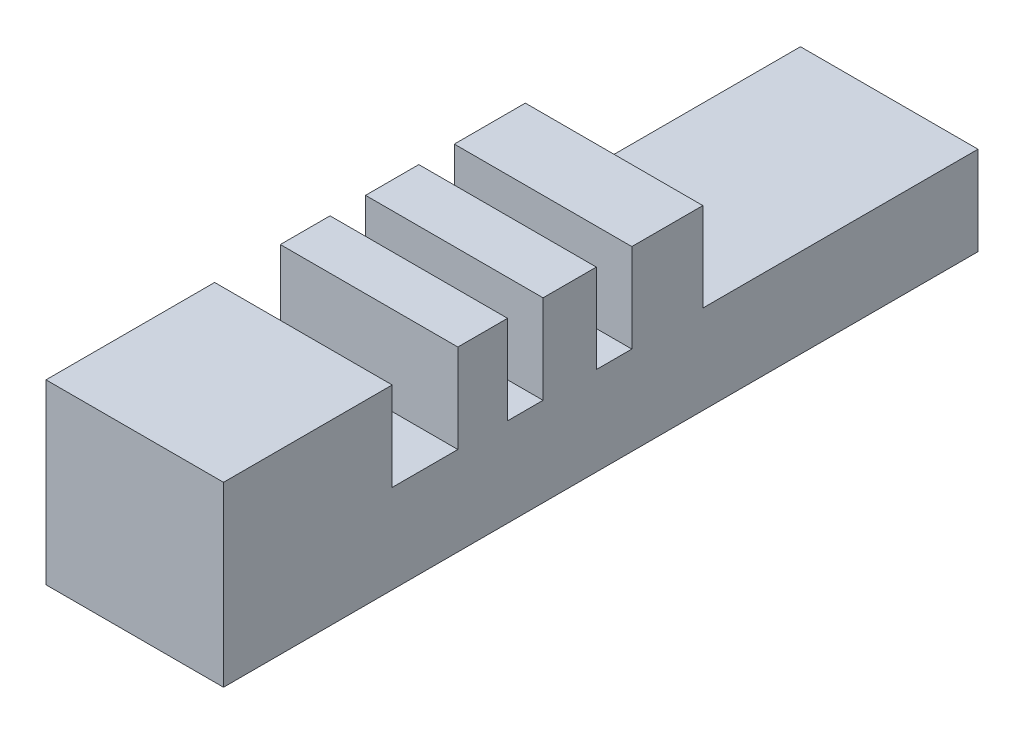
ISO-10303-21;
HEADER;
FILE_DESCRIPTION(('STEP AP214'),'2;1');
FILE_NAME('part.step','',(''),(''),'','','');
FILE_SCHEMA(('AUTOMOTIVE_DESIGN { 1 0 10303 214 1 1 1 1 }'));
ENDSEC;
DATA;
#1=APPLICATION_CONTEXT('core data for automotive mechanical design processes');
#2=APPLICATION_PROTOCOL_DEFINITION('international standard','automotive_design',2000,#1);
#3=PRODUCT_CONTEXT('',#1,'mechanical');
#4=PRODUCT('Part','Part','',(#3));
#5=PRODUCT_RELATED_PRODUCT_CATEGORY('part','',(#4));
#6=PRODUCT_DEFINITION_FORMATION('','',#4);
#7=PRODUCT_DEFINITION_CONTEXT('part definition',#1,'design');
#8=PRODUCT_DEFINITION('design','',#6,#7);
#9=PRODUCT_DEFINITION_SHAPE('','',#8);
#10=(LENGTH_UNIT() NAMED_UNIT(*) SI_UNIT(.MILLI.,.METRE.));
#11=(NAMED_UNIT(*) PLANE_ANGLE_UNIT() SI_UNIT($,.RADIAN.));
#12=(NAMED_UNIT(*) SI_UNIT($,.STERADIAN.) SOLID_ANGLE_UNIT());
#13=UNCERTAINTY_MEASURE_WITH_UNIT(LENGTH_MEASURE(1.E-05),#10,'distance_accuracy_value','');
#14=(GEOMETRIC_REPRESENTATION_CONTEXT(3) GLOBAL_UNCERTAINTY_ASSIGNED_CONTEXT((#13)) GLOBAL_UNIT_ASSIGNED_CONTEXT((#10,
#11,#12)) REPRESENTATION_CONTEXT('',''));
#15=CARTESIAN_POINT('',(0.,0.,0.));
#16=DIRECTION('',(0.,0.,1.));
#17=DIRECTION('',(1.,0.,0.));
#18=AXIS2_PLACEMENT_3D('',#15,#16,#17);
#19=CARTESIAN_POINT('',(0.,5.,0.));
#20=DIRECTION('',(0.,-1.,0.));
#21=DIRECTION('',(0.,0.,-1.));
#22=AXIS2_PLACEMENT_3D('',#19,#20,#21);
#23=PLANE('',#22);
#24=DIRECTION('',(0.,0.,1.));
#25=VECTOR('',#24,1.);
#26=CARTESIAN_POINT('',(0.,5.,0.));
#27=LINE('',#26,#25);
#28=CARTESIAN_POINT('',(0.,5.,-13.2));
#29=VERTEX_POINT('',#28);
#30=CARTESIAN_POINT('',(0.,5.,-9.5));
#31=VERTEX_POINT('',#30);
#32=EDGE_CURVE('E59',#29,#31,#27,.T.);
#33=ORIENTED_EDGE('',*,*,#32,.T.);
#34=DIRECTION('',(1.,0.,0.));
#35=VECTOR('',#34,1.);
#36=CARTESIAN_POINT('',(0.,5.,-9.5));
#37=LINE('',#36,#35);
#38=CARTESIAN_POINT('',(10.,5.,-9.5));
#39=VERTEX_POINT('',#38);
#40=EDGE_CURVE('E54',#31,#39,#37,.T.);
#41=ORIENTED_EDGE('',*,*,#40,.T.);
#42=DIRECTION('',(0.,0.,-1.));
#43=VECTOR('',#42,1.);
#44=CARTESIAN_POINT('',(10.,5.,-42.5));
#45=LINE('',#44,#43);
#46=CARTESIAN_POINT('',(10.,5.,-13.2));
#47=VERTEX_POINT('',#46);
#48=EDGE_CURVE('E271',#39,#47,#45,.T.);
#49=ORIENTED_EDGE('',*,*,#48,.T.);
#50=DIRECTION('',(-1.,0.,0.));
#51=VECTOR('',#50,1.);
#52=CARTESIAN_POINT('',(0.,5.,-13.2));
#53=LINE('',#52,#51);
#54=EDGE_CURVE('E169',#47,#29,#53,.T.);
#55=ORIENTED_EDGE('',*,*,#54,.T.);
#56=EDGE_LOOP('',(#33,#41,#49,#55));
#57=FACE_BOUND('',#56,.T.);
#58=ADVANCED_FACE('F39',(#57),#23,.F.);
#59=CARTESIAN_POINT('',(0.,5.,-18.));
#60=VERTEX_POINT('',#59);
#61=CARTESIAN_POINT('',(0.,5.,-16.));
#62=VERTEX_POINT('',#61);
#63=EDGE_CURVE('E315',#60,#62,#27,.T.);
#64=ORIENTED_EDGE('',*,*,#63,.T.);
#65=DIRECTION('',(1.,0.,0.));
#66=VECTOR('',#65,1.);
#67=CARTESIAN_POINT('',(0.,5.,-16.));
#68=LINE('',#67,#66);
#69=CARTESIAN_POINT('',(10.,5.,-16.));
#70=VERTEX_POINT('',#69);
#71=EDGE_CURVE('E196',#62,#70,#68,.T.);
#72=ORIENTED_EDGE('',*,*,#71,.T.);
#73=CARTESIAN_POINT('',(10.,5.,-18.));
#74=VERTEX_POINT('',#73);
#75=EDGE_CURVE('E274',#70,#74,#45,.T.);
#76=ORIENTED_EDGE('',*,*,#75,.T.);
#77=DIRECTION('',(-1.,0.,0.));
#78=VECTOR('',#77,1.);
#79=CARTESIAN_POINT('',(0.,5.,-18.));
#80=LINE('',#79,#78);
#81=EDGE_CURVE('E217',#74,#60,#80,.T.);
#82=ORIENTED_EDGE('',*,*,#81,.T.);
#83=EDGE_LOOP('',(#64,#72,#76,#82));
#84=FACE_BOUND('',#83,.T.);
#85=ADVANCED_FACE('F357',(#84),#23,.F.);
#86=CARTESIAN_POINT('',(0.,5.,-23.));
#87=VERTEX_POINT('',#86);
#88=CARTESIAN_POINT('',(0.,5.,-21.));
#89=VERTEX_POINT('',#88);
#90=EDGE_CURVE('E279',#87,#89,#27,.T.);
#91=ORIENTED_EDGE('',*,*,#90,.T.);
#92=DIRECTION('',(1.,0.,0.));
#93=VECTOR('',#92,1.);
#94=CARTESIAN_POINT('',(0.,5.,-21.));
#95=LINE('',#94,#93);
#96=CARTESIAN_POINT('',(10.,5.,-21.));
#97=VERTEX_POINT('',#96);
#98=EDGE_CURVE('E222',#89,#97,#95,.T.);
#99=ORIENTED_EDGE('',*,*,#98,.T.);
#100=CARTESIAN_POINT('',(10.,5.,-23.));
#101=VERTEX_POINT('',#100);
#102=EDGE_CURVE('E331',#97,#101,#45,.T.);
#103=ORIENTED_EDGE('',*,*,#102,.T.);
#104=DIRECTION('',(1.,0.,0.));
#105=VECTOR('',#104,1.);
#106=CARTESIAN_POINT('',(0.,5.,-23.));
#107=LINE('',#106,#105);
#108=EDGE_CURVE('E249',#87,#101,#107,.T.);
#109=ORIENTED_EDGE('',*,*,#108,.F.);
#110=EDGE_LOOP('',(#91,#99,#103,#109));
#111=FACE_BOUND('',#110,.T.);
#112=ADVANCED_FACE('F319',(#111),#23,.F.);
#113=CARTESIAN_POINT('',(10.,5.,0.));
#114=DIRECTION('',(0.,0.,-1.));
#115=DIRECTION('',(-1.,0.,0.));
#116=AXIS2_PLACEMENT_3D('',#113,#114,#115);
#117=PLANE('',#116);
#118=DIRECTION('',(1.,0.,0.));
#119=VECTOR('',#118,1.);
#120=CARTESIAN_POINT('',(10.,0.,0.));
#121=LINE('',#120,#119);
#122=CARTESIAN_POINT('',(0.,0.,0.));
#123=VERTEX_POINT('',#122);
#124=CARTESIAN_POINT('',(10.,0.,0.));
#125=VERTEX_POINT('',#124);
#126=EDGE_CURVE('E270',#123,#125,#121,.T.);
#127=ORIENTED_EDGE('',*,*,#126,.T.);
#128=DIRECTION('',(0.,-1.,0.));
#129=VECTOR('',#128,1.);
#130=CARTESIAN_POINT('',(10.,5.,0.));
#131=LINE('',#130,#129);
#132=CARTESIAN_POINT('',(10.,10.,0.));
#133=VERTEX_POINT('',#132);
#134=EDGE_CURVE('E11',#133,#125,#131,.T.);
#135=ORIENTED_EDGE('',*,*,#134,.F.);
#136=DIRECTION('',(1.,0.,0.));
#137=VECTOR('',#136,1.);
#138=CARTESIAN_POINT('',(0.,10.,0.));
#139=LINE('',#138,#137);
#140=CARTESIAN_POINT('',(0.,10.,0.));
#141=VERTEX_POINT('',#140);
#142=EDGE_CURVE('E180',#141,#133,#139,.T.);
#143=ORIENTED_EDGE('',*,*,#142,.F.);
#144=DIRECTION('',(0.,-1.,0.));
#145=VECTOR('',#144,1.);
#146=CARTESIAN_POINT('',(0.,5.,0.));
#147=LINE('',#146,#145);
#148=EDGE_CURVE('E176',#141,#123,#147,.T.);
#149=ORIENTED_EDGE('',*,*,#148,.T.);
#150=EDGE_LOOP('',(#127,#135,#143,#149));
#151=FACE_BOUND('',#150,.T.);
#152=ADVANCED_FACE('F41',(#151),#117,.F.);
#153=CARTESIAN_POINT('',(10.,5.,-42.5));
#154=DIRECTION('',(-1.,0.,0.));
#155=DIRECTION('',(0.,0.,1.));
#156=AXIS2_PLACEMENT_3D('',#153,#154,#155);
#157=PLANE('',#156);
#158=DIRECTION('',(0.,0.,-1.));
#159=VECTOR('',#158,1.);
#160=CARTESIAN_POINT('',(10.,0.,-42.5));
#161=LINE('',#160,#159);
#162=CARTESIAN_POINT('',(10.,0.,-42.5));
#163=VERTEX_POINT('',#162);
#164=EDGE_CURVE('E282',#125,#163,#161,.T.);
#165=ORIENTED_EDGE('',*,*,#164,.T.);
#166=DIRECTION('',(0.,-1.,0.));
#167=VECTOR('',#166,1.);
#168=CARTESIAN_POINT('',(10.,5.,-42.5));
#169=LINE('',#168,#167);
#170=CARTESIAN_POINT('',(10.,5.,-42.5));
#171=VERTEX_POINT('',#170);
#172=EDGE_CURVE('E47',#171,#163,#169,.T.);
#173=ORIENTED_EDGE('',*,*,#172,.F.);
#174=CARTESIAN_POINT('',(10.,5.,-27.));
#175=VERTEX_POINT('',#174);
#176=EDGE_CURVE('E275',#175,#171,#45,.T.);
#177=ORIENTED_EDGE('',*,*,#176,.F.);
#178=DIRECTION('',(0.,-1.,0.));
#179=VECTOR('',#178,1.);
#180=CARTESIAN_POINT('',(10.,10.,-27.));
#181=LINE('',#180,#179);
#182=CARTESIAN_POINT('',(10.,10.,-27.));
#183=VERTEX_POINT('',#182);
#184=EDGE_CURVE('E255',#183,#175,#181,.T.);
#185=ORIENTED_EDGE('',*,*,#184,.F.);
#186=DIRECTION('',(0.,0.,-1.));
#187=VECTOR('',#186,1.);
#188=CARTESIAN_POINT('',(10.,10.,0.));
#189=LINE('',#188,#187);
#190=CARTESIAN_POINT('',(10.,10.,-23.));
#191=VERTEX_POINT('',#190);
#192=EDGE_CURVE('E253',#191,#183,#189,.T.);
#193=ORIENTED_EDGE('',*,*,#192,.F.);
#194=DIRECTION('',(0.,-1.,0.));
#195=VECTOR('',#194,1.);
#196=CARTESIAN_POINT('',(10.,10.,-23.));
#197=LINE('',#196,#195);
#198=EDGE_CURVE('E261',#191,#101,#197,.T.);
#199=ORIENTED_EDGE('',*,*,#198,.T.);
#200=ORIENTED_EDGE('',*,*,#102,.F.);
#201=DIRECTION('',(0.,-1.,0.));
#202=VECTOR('',#201,1.);
#203=CARTESIAN_POINT('',(10.,10.,-21.));
#204=LINE('',#203,#202);
#205=CARTESIAN_POINT('',(10.,10.,-21.));
#206=VERTEX_POINT('',#205);
#207=EDGE_CURVE('E238',#206,#97,#204,.T.);
#208=ORIENTED_EDGE('',*,*,#207,.F.);
#209=DIRECTION('',(0.,0.,-1.));
#210=VECTOR('',#209,1.);
#211=CARTESIAN_POINT('',(10.,10.,0.));
#212=LINE('',#211,#210);
#213=CARTESIAN_POINT('',(10.,10.,-18.));
#214=VERTEX_POINT('',#213);
#215=EDGE_CURVE('E221',#214,#206,#212,.T.);
#216=ORIENTED_EDGE('',*,*,#215,.F.);
#217=DIRECTION('',(0.,-1.,0.));
#218=VECTOR('',#217,1.);
#219=CARTESIAN_POINT('',(10.,10.,-18.));
#220=LINE('',#219,#218);
#221=EDGE_CURVE('E241',#214,#74,#220,.T.);
#222=ORIENTED_EDGE('',*,*,#221,.T.);
#223=ORIENTED_EDGE('',*,*,#75,.F.);
#224=DIRECTION('',(0.,-1.,0.));
#225=VECTOR('',#224,1.);
#226=CARTESIAN_POINT('',(10.,10.,-16.));
#227=LINE('',#226,#225);
#228=CARTESIAN_POINT('',(10.,10.,-16.));
#229=VERTEX_POINT('',#228);
#230=EDGE_CURVE('E211',#229,#70,#227,.T.);
#231=ORIENTED_EDGE('',*,*,#230,.F.);
#232=DIRECTION('',(0.,0.,-1.));
#233=VECTOR('',#232,1.);
#234=CARTESIAN_POINT('',(10.,10.,0.));
#235=LINE('',#234,#233);
#236=CARTESIAN_POINT('',(10.,10.,-13.2));
#237=VERTEX_POINT('',#236);
#238=EDGE_CURVE('E195',#237,#229,#235,.T.);
#239=ORIENTED_EDGE('',*,*,#238,.F.);
#240=DIRECTION('',(0.,-1.,0.));
#241=VECTOR('',#240,1.);
#242=CARTESIAN_POINT('',(10.,10.,-13.2));
#243=LINE('',#242,#241);
#244=EDGE_CURVE('E214',#237,#47,#243,.T.);
#245=ORIENTED_EDGE('',*,*,#244,.T.);
#246=ORIENTED_EDGE('',*,*,#48,.F.);
#247=DIRECTION('',(0.,-1.,0.));
#248=VECTOR('',#247,1.);
#249=CARTESIAN_POINT('',(10.,10.,-9.5));
#250=LINE('',#249,#248);
#251=CARTESIAN_POINT('',(10.,10.,-9.5));
#252=VERTEX_POINT('',#251);
#253=EDGE_CURVE('E170',#252,#39,#250,.T.);
#254=ORIENTED_EDGE('',*,*,#253,.F.);
#255=DIRECTION('',(0.,0.,-1.));
#256=VECTOR('',#255,1.);
#257=CARTESIAN_POINT('',(10.,10.,0.));
#258=LINE('',#257,#256);
#259=EDGE_CURVE('E184',#133,#252,#258,.T.);
#260=ORIENTED_EDGE('',*,*,#259,.F.);
#261=ORIENTED_EDGE('',*,*,#134,.T.);
#262=EDGE_LOOP('',(#165,#173,#177,#185,#193,#199,#200,#208,#216,#222,#223,#231,#239,#245,#246,
#254,#260,#261));
#263=FACE_BOUND('',#262,.T.);
#264=ADVANCED_FACE('F306',(#263),#157,.F.);
#265=CARTESIAN_POINT('',(0.,5.,-42.5));
#266=DIRECTION('',(0.,0.,1.));
#267=DIRECTION('',(1.,0.,0.));
#268=AXIS2_PLACEMENT_3D('',#265,#266,#267);
#269=PLANE('',#268);
#270=DIRECTION('',(-1.,0.,0.));
#271=VECTOR('',#270,1.);
#272=CARTESIAN_POINT('',(0.,0.,-42.5));
#273=LINE('',#272,#271);
#274=CARTESIAN_POINT('',(0.,0.,-42.5));
#275=VERTEX_POINT('',#274);
#276=EDGE_CURVE('E284',#163,#275,#273,.T.);
#277=ORIENTED_EDGE('',*,*,#276,.T.);
#278=DIRECTION('',(0.,-1.,0.));
#279=VECTOR('',#278,1.);
#280=CARTESIAN_POINT('',(0.,5.,-42.5));
#281=LINE('',#280,#279);
#282=CARTESIAN_POINT('',(0.,5.,-42.5));
#283=VERTEX_POINT('',#282);
#284=EDGE_CURVE('E289',#283,#275,#281,.T.);
#285=ORIENTED_EDGE('',*,*,#284,.F.);
#286=DIRECTION('',(-1.,0.,0.));
#287=VECTOR('',#286,1.);
#288=CARTESIAN_POINT('',(0.,5.,-42.5));
#289=LINE('',#288,#287);
#290=EDGE_CURVE('E273',#171,#283,#289,.T.);
#291=ORIENTED_EDGE('',*,*,#290,.F.);
#292=ORIENTED_EDGE('',*,*,#172,.T.);
#293=EDGE_LOOP('',(#277,#285,#291,#292));
#294=FACE_BOUND('',#293,.T.);
#295=ADVANCED_FACE('F296',(#294),#269,.F.);
#296=CARTESIAN_POINT('',(0.,5.,0.));
#297=DIRECTION('',(1.,0.,0.));
#298=DIRECTION('',(0.,0.,-1.));
#299=AXIS2_PLACEMENT_3D('',#296,#297,#298);
#300=PLANE('',#299);
#301=DIRECTION('',(0.,0.,1.));
#302=VECTOR('',#301,1.);
#303=CARTESIAN_POINT('',(0.,0.,0.));
#304=LINE('',#303,#302);
#305=EDGE_CURVE('E286',#275,#123,#304,.T.);
#306=ORIENTED_EDGE('',*,*,#305,.T.);
#307=ORIENTED_EDGE('',*,*,#148,.F.);
#308=DIRECTION('',(0.,0.,1.));
#309=VECTOR('',#308,1.);
#310=CARTESIAN_POINT('',(0.,10.,0.));
#311=LINE('',#310,#309);
#312=CARTESIAN_POINT('',(0.,10.,-9.5));
#313=VERTEX_POINT('',#312);
#314=EDGE_CURVE('E173',#313,#141,#311,.T.);
#315=ORIENTED_EDGE('',*,*,#314,.F.);
#316=DIRECTION('',(0.,-1.,0.));
#317=VECTOR('',#316,1.);
#318=CARTESIAN_POINT('',(0.,10.,-9.5));
#319=LINE('',#318,#317);
#320=EDGE_CURVE('E162',#313,#31,#319,.T.);
#321=ORIENTED_EDGE('',*,*,#320,.T.);
#322=ORIENTED_EDGE('',*,*,#32,.F.);
#323=DIRECTION('',(0.,-1.,0.));
#324=VECTOR('',#323,1.);
#325=CARTESIAN_POINT('',(0.,10.,-13.2));
#326=LINE('',#325,#324);
#327=CARTESIAN_POINT('',(0.,10.,-13.2));
#328=VERTEX_POINT('',#327);
#329=EDGE_CURVE('E203',#328,#29,#326,.T.);
#330=ORIENTED_EDGE('',*,*,#329,.F.);
#331=DIRECTION('',(0.,0.,1.));
#332=VECTOR('',#331,1.);
#333=CARTESIAN_POINT('',(0.,10.,0.));
#334=LINE('',#333,#332);
#335=CARTESIAN_POINT('',(0.,10.,-16.));
#336=VERTEX_POINT('',#335);
#337=EDGE_CURVE('E201',#336,#328,#334,.T.);
#338=ORIENTED_EDGE('',*,*,#337,.F.);
#339=DIRECTION('',(0.,-1.,0.));
#340=VECTOR('',#339,1.);
#341=CARTESIAN_POINT('',(0.,10.,-16.));
#342=LINE('',#341,#340);
#343=EDGE_CURVE('E208',#336,#62,#342,.T.);
#344=ORIENTED_EDGE('',*,*,#343,.T.);
#345=ORIENTED_EDGE('',*,*,#63,.F.);
#346=DIRECTION('',(0.,-1.,0.));
#347=VECTOR('',#346,1.);
#348=CARTESIAN_POINT('',(0.,10.,-18.));
#349=LINE('',#348,#347);
#350=CARTESIAN_POINT('',(0.,10.,-18.));
#351=VERTEX_POINT('',#350);
#352=EDGE_CURVE('E229',#351,#60,#349,.T.);
#353=ORIENTED_EDGE('',*,*,#352,.F.);
#354=DIRECTION('',(0.,0.,1.));
#355=VECTOR('',#354,1.);
#356=CARTESIAN_POINT('',(0.,10.,0.));
#357=LINE('',#356,#355);
#358=CARTESIAN_POINT('',(0.,10.,-21.));
#359=VERTEX_POINT('',#358);
#360=EDGE_CURVE('E227',#359,#351,#357,.T.);
#361=ORIENTED_EDGE('',*,*,#360,.F.);
#362=DIRECTION('',(0.,-1.,0.));
#363=VECTOR('',#362,1.);
#364=CARTESIAN_POINT('',(0.,10.,-21.));
#365=LINE('',#364,#363);
#366=EDGE_CURVE('E235',#359,#89,#365,.T.);
#367=ORIENTED_EDGE('',*,*,#366,.T.);
#368=ORIENTED_EDGE('',*,*,#90,.F.);
#369=DIRECTION('',(0.,-1.,0.));
#370=VECTOR('',#369,1.);
#371=CARTESIAN_POINT('',(0.,10.,-23.));
#372=LINE('',#371,#370);
#373=CARTESIAN_POINT('',(0.,10.,-23.));
#374=VERTEX_POINT('',#373);
#375=EDGE_CURVE('E264',#374,#87,#372,.T.);
#376=ORIENTED_EDGE('',*,*,#375,.F.);
#377=DIRECTION('',(0.,0.,1.));
#378=VECTOR('',#377,1.);
#379=CARTESIAN_POINT('',(0.,10.,0.));
#380=LINE('',#379,#378);
#381=CARTESIAN_POINT('',(0.,10.,-27.));
#382=VERTEX_POINT('',#381);
#383=EDGE_CURVE('E248',#382,#374,#380,.T.);
#384=ORIENTED_EDGE('',*,*,#383,.F.);
#385=DIRECTION('',(0.,-1.,0.));
#386=VECTOR('',#385,1.);
#387=CARTESIAN_POINT('',(0.,10.,-27.));
#388=LINE('',#387,#386);
#389=CARTESIAN_POINT('',(0.,5.,-27.));
#390=VERTEX_POINT('',#389);
#391=EDGE_CURVE('E267',#382,#390,#388,.T.);
#392=ORIENTED_EDGE('',*,*,#391,.T.);
#393=EDGE_CURVE('E277',#283,#390,#27,.T.);
#394=ORIENTED_EDGE('',*,*,#393,.F.);
#395=ORIENTED_EDGE('',*,*,#284,.T.);
#396=EDGE_LOOP('',(#306,#307,#315,#321,#322,#330,#338,#344,#345,#353,#361,#367,#368,#376,#384,
#392,#394,#395));
#397=FACE_BOUND('',#396,.T.);
#398=ADVANCED_FACE('F174',(#397),#300,.F.);
#399=ORIENTED_EDGE('',*,*,#393,.T.);
#400=DIRECTION('',(1.,0.,0.));
#401=VECTOR('',#400,1.);
#402=CARTESIAN_POINT('',(0.,5.,-27.));
#403=LINE('',#402,#401);
#404=EDGE_CURVE('E244',#390,#175,#403,.T.);
#405=ORIENTED_EDGE('',*,*,#404,.T.);
#406=ORIENTED_EDGE('',*,*,#176,.T.);
#407=ORIENTED_EDGE('',*,*,#290,.T.);
#408=EDGE_LOOP('',(#399,#405,#406,#407));
#409=FACE_BOUND('',#408,.T.);
#410=ADVANCED_FACE('F335',(#409),#23,.F.);
#411=CARTESIAN_POINT('',(0.,0.,0.));
#412=DIRECTION('',(0.,-1.,0.));
#413=DIRECTION('',(0.,0.,-1.));
#414=AXIS2_PLACEMENT_3D('',#411,#412,#413);
#415=PLANE('',#414);
#416=ORIENTED_EDGE('',*,*,#126,.F.);
#417=ORIENTED_EDGE('',*,*,#305,.F.);
#418=ORIENTED_EDGE('',*,*,#276,.F.);
#419=ORIENTED_EDGE('',*,*,#164,.F.);
#420=EDGE_LOOP('',(#416,#417,#418,#419));
#421=FACE_BOUND('',#420,.T.);
#422=ADVANCED_FACE('F303',(#421),#415,.T.);
#423=CARTESIAN_POINT('',(0.,10.,-27.));
#424=DIRECTION('',(0.,0.,-1.));
#425=DIRECTION('',(-1.,0.,0.));
#426=AXIS2_PLACEMENT_3D('',#423,#424,#425);
#427=PLANE('',#426);
#428=ORIENTED_EDGE('',*,*,#404,.F.);
#429=ORIENTED_EDGE('',*,*,#391,.F.);
#430=DIRECTION('',(1.,0.,0.));
#431=VECTOR('',#430,1.);
#432=CARTESIAN_POINT('',(0.,10.,-27.));
#433=LINE('',#432,#431);
#434=EDGE_CURVE('E245',#382,#183,#433,.T.);
#435=ORIENTED_EDGE('',*,*,#434,.T.);
#436=ORIENTED_EDGE('',*,*,#184,.T.);
#437=EDGE_LOOP('',(#428,#429,#435,#436));
#438=FACE_BOUND('',#437,.T.);
#439=ADVANCED_FACE('F339',(#438),#427,.T.);
#440=CARTESIAN_POINT('',(0.,10.,-23.));
#441=DIRECTION('',(0.,0.,-1.));
#442=DIRECTION('',(-1.,0.,0.));
#443=AXIS2_PLACEMENT_3D('',#440,#441,#442);
#444=PLANE('',#443);
#445=ORIENTED_EDGE('',*,*,#108,.T.);
#446=ORIENTED_EDGE('',*,*,#198,.F.);
#447=DIRECTION('',(1.,0.,0.));
#448=VECTOR('',#447,1.);
#449=CARTESIAN_POINT('',(0.,10.,-23.));
#450=LINE('',#449,#448);
#451=EDGE_CURVE('E251',#374,#191,#450,.T.);
#452=ORIENTED_EDGE('',*,*,#451,.F.);
#453=ORIENTED_EDGE('',*,*,#375,.T.);
#454=EDGE_LOOP('',(#445,#446,#452,#453));
#455=FACE_BOUND('',#454,.T.);
#456=ADVANCED_FACE('F346',(#455),#444,.F.);
#457=CARTESIAN_POINT('',(0.,10.,0.));
#458=DIRECTION('',(0.,1.,0.));
#459=DIRECTION('',(0.,0.,1.));
#460=AXIS2_PLACEMENT_3D('',#457,#458,#459);
#461=PLANE('',#460);
#462=ORIENTED_EDGE('',*,*,#434,.F.);
#463=ORIENTED_EDGE('',*,*,#383,.T.);
#464=ORIENTED_EDGE('',*,*,#451,.T.);
#465=ORIENTED_EDGE('',*,*,#192,.T.);
#466=EDGE_LOOP('',(#462,#463,#464,#465));
#467=FACE_BOUND('',#466,.T.);
#468=ADVANCED_FACE('F343',(#467),#461,.T.);
#469=CARTESIAN_POINT('',(0.,10.,-18.));
#470=DIRECTION('',(0.,0.,1.));
#471=DIRECTION('',(1.,0.,0.));
#472=AXIS2_PLACEMENT_3D('',#469,#470,#471);
#473=PLANE('',#472);
#474=ORIENTED_EDGE('',*,*,#81,.F.);
#475=ORIENTED_EDGE('',*,*,#221,.F.);
#476=DIRECTION('',(-1.,0.,0.));
#477=VECTOR('',#476,1.);
#478=CARTESIAN_POINT('',(0.,10.,-18.));
#479=LINE('',#478,#477);
#480=EDGE_CURVE('E218',#214,#351,#479,.T.);
#481=ORIENTED_EDGE('',*,*,#480,.T.);
#482=ORIENTED_EDGE('',*,*,#352,.T.);
#483=EDGE_LOOP('',(#474,#475,#481,#482));
#484=FACE_BOUND('',#483,.T.);
#485=ADVANCED_FACE('F353',(#484),#473,.T.);
#486=CARTESIAN_POINT('',(0.,10.,-21.));
#487=DIRECTION('',(0.,0.,-1.));
#488=DIRECTION('',(-1.,0.,0.));
#489=AXIS2_PLACEMENT_3D('',#486,#487,#488);
#490=PLANE('',#489);
#491=ORIENTED_EDGE('',*,*,#98,.F.);
#492=ORIENTED_EDGE('',*,*,#366,.F.);
#493=DIRECTION('',(1.,0.,0.));
#494=VECTOR('',#493,1.);
#495=CARTESIAN_POINT('',(0.,10.,-21.));
#496=LINE('',#495,#494);
#497=EDGE_CURVE('E224',#359,#206,#496,.T.);
#498=ORIENTED_EDGE('',*,*,#497,.T.);
#499=ORIENTED_EDGE('',*,*,#207,.T.);
#500=EDGE_LOOP('',(#491,#492,#498,#499));
#501=FACE_BOUND('',#500,.T.);
#502=ADVANCED_FACE('F327',(#501),#490,.T.);
#503=CARTESIAN_POINT('',(0.,10.,0.));
#504=DIRECTION('',(0.,1.,0.));
#505=DIRECTION('',(0.,0.,1.));
#506=AXIS2_PLACEMENT_3D('',#503,#504,#505);
#507=PLANE('',#506);
#508=ORIENTED_EDGE('',*,*,#480,.F.);
#509=ORIENTED_EDGE('',*,*,#215,.T.);
#510=ORIENTED_EDGE('',*,*,#497,.F.);
#511=ORIENTED_EDGE('',*,*,#360,.T.);
#512=EDGE_LOOP('',(#508,#509,#510,#511));
#513=FACE_BOUND('',#512,.T.);
#514=ADVANCED_FACE('F430',(#513),#507,.T.);
#515=CARTESIAN_POINT('',(0.,10.,-13.2));
#516=DIRECTION('',(0.,0.,1.));
#517=DIRECTION('',(1.,0.,0.));
#518=AXIS2_PLACEMENT_3D('',#515,#516,#517);
#519=PLANE('',#518);
#520=ORIENTED_EDGE('',*,*,#54,.F.);
#521=ORIENTED_EDGE('',*,*,#244,.F.);
#522=DIRECTION('',(-1.,0.,0.));
#523=VECTOR('',#522,1.);
#524=CARTESIAN_POINT('',(0.,10.,-13.2));
#525=LINE('',#524,#523);
#526=EDGE_CURVE('E192',#237,#328,#525,.T.);
#527=ORIENTED_EDGE('',*,*,#526,.T.);
#528=ORIENTED_EDGE('',*,*,#329,.T.);
#529=EDGE_LOOP('',(#520,#521,#527,#528));
#530=FACE_BOUND('',#529,.T.);
#531=ADVANCED_FACE('F311',(#530),#519,.T.);
#532=CARTESIAN_POINT('',(0.,10.,-16.));
#533=DIRECTION('',(0.,0.,-1.));
#534=DIRECTION('',(-1.,0.,0.));
#535=AXIS2_PLACEMENT_3D('',#532,#533,#534);
#536=PLANE('',#535);
#537=ORIENTED_EDGE('',*,*,#71,.F.);
#538=ORIENTED_EDGE('',*,*,#343,.F.);
#539=DIRECTION('',(1.,0.,0.));
#540=VECTOR('',#539,1.);
#541=CARTESIAN_POINT('',(0.,10.,-16.));
#542=LINE('',#541,#540);
#543=EDGE_CURVE('E198',#336,#229,#542,.T.);
#544=ORIENTED_EDGE('',*,*,#543,.T.);
#545=ORIENTED_EDGE('',*,*,#230,.T.);
#546=EDGE_LOOP('',(#537,#538,#544,#545));
#547=FACE_BOUND('',#546,.T.);
#548=ADVANCED_FACE('F448',(#547),#536,.T.);
#549=CARTESIAN_POINT('',(0.,10.,0.));
#550=DIRECTION('',(0.,1.,0.));
#551=DIRECTION('',(0.,0.,1.));
#552=AXIS2_PLACEMENT_3D('',#549,#550,#551);
#553=PLANE('',#552);
#554=ORIENTED_EDGE('',*,*,#526,.F.);
#555=ORIENTED_EDGE('',*,*,#238,.T.);
#556=ORIENTED_EDGE('',*,*,#543,.F.);
#557=ORIENTED_EDGE('',*,*,#337,.T.);
#558=EDGE_LOOP('',(#554,#555,#556,#557));
#559=FACE_BOUND('',#558,.T.);
#560=ADVANCED_FACE('F457',(#559),#553,.T.);
#561=CARTESIAN_POINT('',(0.,10.,-9.5));
#562=DIRECTION('',(0.,0.,-1.));
#563=DIRECTION('',(-1.,0.,0.));
#564=AXIS2_PLACEMENT_3D('',#561,#562,#563);
#565=PLANE('',#564);
#566=ORIENTED_EDGE('',*,*,#40,.F.);
#567=ORIENTED_EDGE('',*,*,#320,.F.);
#568=DIRECTION('',(1.,0.,0.));
#569=VECTOR('',#568,1.);
#570=CARTESIAN_POINT('',(0.,10.,-9.5));
#571=LINE('',#570,#569);
#572=EDGE_CURVE('E167',#313,#252,#571,.T.);
#573=ORIENTED_EDGE('',*,*,#572,.T.);
#574=ORIENTED_EDGE('',*,*,#253,.T.);
#575=EDGE_LOOP('',(#566,#567,#573,#574));
#576=FACE_BOUND('',#575,.T.);
#577=ADVANCED_FACE('F164',(#576),#565,.T.);
#578=CARTESIAN_POINT('',(0.,10.,0.));
#579=DIRECTION('',(0.,1.,0.));
#580=DIRECTION('',(0.,0.,1.));
#581=AXIS2_PLACEMENT_3D('',#578,#579,#580);
#582=PLANE('',#581);
#583=ORIENTED_EDGE('',*,*,#572,.F.);
#584=ORIENTED_EDGE('',*,*,#314,.T.);
#585=ORIENTED_EDGE('',*,*,#142,.T.);
#586=ORIENTED_EDGE('',*,*,#259,.T.);
#587=EDGE_LOOP('',(#583,#584,#585,#586));
#588=FACE_BOUND('',#587,.T.);
#589=ADVANCED_FACE('F182',(#588),#582,.T.);
#590=CLOSED_SHELL('',(#58,#85,#112,#152,#264,#295,#398,#410,#422,#439,#456,#468,#485,#502,#514,
#531,#548,#560,#577,#589));
#591=MANIFOLD_SOLID_BREP('B2',#590);
#592=ADVANCED_BREP_SHAPE_REPRESENTATION('',(#18,#591),#14);
#593=SHAPE_DEFINITION_REPRESENTATION(#9,#592);
ENDSEC;
END-ISO-10303-21;
